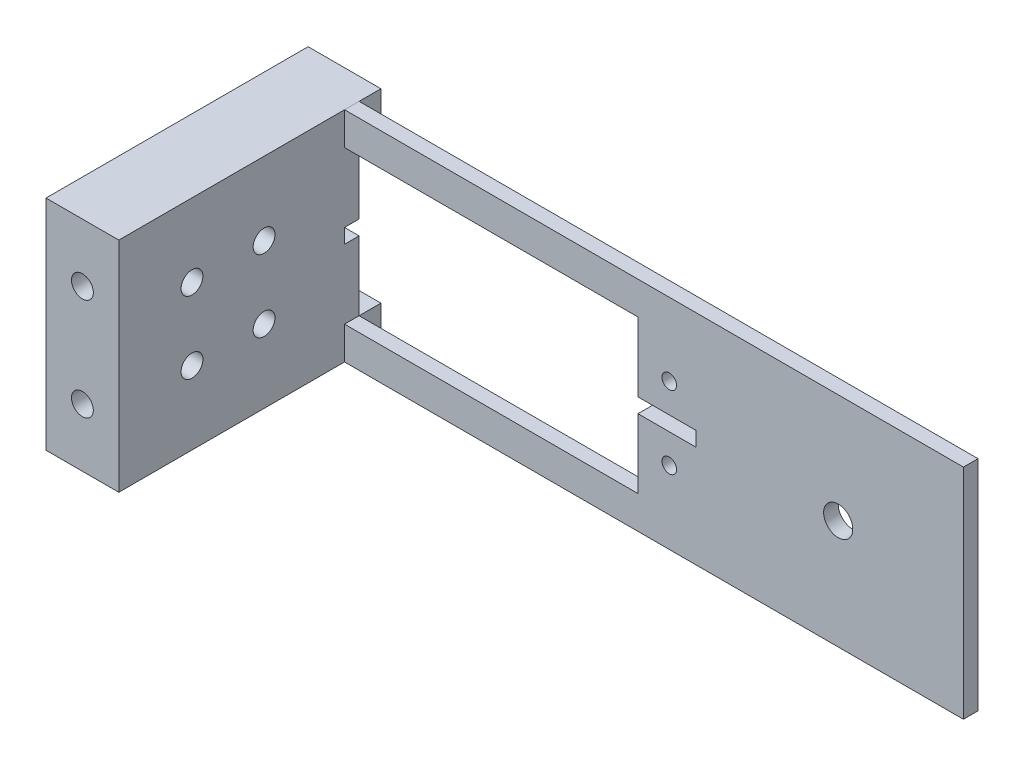
ISO-10303-21;
HEADER;
FILE_DESCRIPTION(('STEP AP214'),'2;1');
FILE_NAME('part.step','',(''),(''),'','','');
FILE_SCHEMA(('AUTOMOTIVE_DESIGN { 1 0 10303 214 1 1 1 1 }'));
ENDSEC;
DATA;
#1=APPLICATION_CONTEXT('core data for automotive mechanical design processes');
#2=APPLICATION_PROTOCOL_DEFINITION('international standard','automotive_design',2000,#1);
#3=PRODUCT_CONTEXT('',#1,'mechanical');
#4=PRODUCT('Part','Part','',(#3));
#5=PRODUCT_RELATED_PRODUCT_CATEGORY('part','',(#4));
#6=PRODUCT_DEFINITION_FORMATION('','',#4);
#7=PRODUCT_DEFINITION_CONTEXT('part definition',#1,'design');
#8=PRODUCT_DEFINITION('design','',#6,#7);
#9=PRODUCT_DEFINITION_SHAPE('','',#8);
#10=(LENGTH_UNIT() NAMED_UNIT(*) SI_UNIT(.MILLI.,.METRE.));
#11=(NAMED_UNIT(*) PLANE_ANGLE_UNIT() SI_UNIT($,.RADIAN.));
#12=(NAMED_UNIT(*) SI_UNIT($,.STERADIAN.) SOLID_ANGLE_UNIT());
#13=UNCERTAINTY_MEASURE_WITH_UNIT(LENGTH_MEASURE(1.E-05),#10,'distance_accuracy_value','');
#14=(GEOMETRIC_REPRESENTATION_CONTEXT(3) GLOBAL_UNCERTAINTY_ASSIGNED_CONTEXT((#13)) GLOBAL_UNIT_ASSIGNED_CONTEXT((#10,
#11,#12)) REPRESENTATION_CONTEXT('',''));
#15=CARTESIAN_POINT('',(0.,0.,0.));
#16=DIRECTION('',(0.,0.,1.));
#17=DIRECTION('',(1.,0.,0.));
#18=AXIS2_PLACEMENT_3D('',#15,#16,#17);
#19=CARTESIAN_POINT('',(10.,14.,-33.));
#20=DIRECTION('',(1.,0.,0.));
#21=DIRECTION('',(0.,0.,-1.));
#22=AXIS2_PLACEMENT_3D('',#19,#20,#21);
#23=PLANE('',#22);
#24=DIRECTION('',(0.,-1.,0.));
#25=VECTOR('',#24,1.);
#26=CARTESIAN_POINT('',(10.,4.5,-33.));
#27=LINE('',#26,#25);
#28=CARTESIAN_POINT('',(9.99999999999999,25.5,-33.));
#29=VERTEX_POINT('',#28);
#30=CARTESIAN_POINT('',(10.,16.,-33.));
#31=VERTEX_POINT('',#30);
#32=EDGE_CURVE('E143',#29,#31,#27,.T.);
#33=ORIENTED_EDGE('',*,*,#32,.F.);
#34=DIRECTION('',(0.,0.,-1.));
#35=VECTOR('',#34,1.);
#36=CARTESIAN_POINT('',(10.,25.5,-33.));
#37=LINE('',#36,#35);
#38=CARTESIAN_POINT('',(10.,25.5,-36.));
#39=VERTEX_POINT('',#38);
#40=EDGE_CURVE('E147',#29,#39,#37,.T.);
#41=ORIENTED_EDGE('',*,*,#40,.T.);
#42=DIRECTION('',(0.,-1.,0.));
#43=VECTOR('',#42,1.);
#44=CARTESIAN_POINT('',(10.,30.,-36.));
#45=LINE('',#44,#43);
#46=CARTESIAN_POINT('',(10.,30.,-36.));
#47=VERTEX_POINT('',#46);
#48=EDGE_CURVE('E229',#47,#39,#45,.T.);
#49=ORIENTED_EDGE('',*,*,#48,.F.);
#50=DIRECTION('',(0.,0.,-1.));
#51=VECTOR('',#50,1.);
#52=CARTESIAN_POINT('',(9.99999999999994,30.,0.));
#53=LINE('',#52,#51);
#54=CARTESIAN_POINT('',(10.,30.,0.));
#55=VERTEX_POINT('',#54);
#56=EDGE_CURVE('E261',#55,#47,#53,.T.);
#57=ORIENTED_EDGE('',*,*,#56,.F.);
#58=DIRECTION('',(0.,-1.,0.));
#59=VECTOR('',#58,1.);
#60=CARTESIAN_POINT('',(10.,30.,0.));
#61=LINE('',#60,#59);
#62=CARTESIAN_POINT('',(10.,0.,0.));
#63=VERTEX_POINT('',#62);
#64=EDGE_CURVE('E253',#55,#63,#61,.T.);
#65=ORIENTED_EDGE('',*,*,#64,.T.);
#66=DIRECTION('',(0.,0.,-1.));
#67=VECTOR('',#66,1.);
#68=CARTESIAN_POINT('',(9.99999999999994,0.,0.));
#69=LINE('',#68,#67);
#70=CARTESIAN_POINT('',(10.,0.,-36.));
#71=VERTEX_POINT('',#70);
#72=EDGE_CURVE('E246',#63,#71,#69,.T.);
#73=ORIENTED_EDGE('',*,*,#72,.T.);
#74=CARTESIAN_POINT('',(10.,4.5,-36.));
#75=VERTEX_POINT('',#74);
#76=EDGE_CURVE('E248',#75,#71,#45,.T.);
#77=ORIENTED_EDGE('',*,*,#76,.F.);
#78=DIRECTION('',(0.,0.,-1.));
#79=VECTOR('',#78,1.);
#80=CARTESIAN_POINT('',(10.,4.5,-33.));
#81=LINE('',#80,#79);
#82=CARTESIAN_POINT('',(10.,4.5,-33.));
#83=VERTEX_POINT('',#82);
#84=EDGE_CURVE('E171',#83,#75,#81,.T.);
#85=ORIENTED_EDGE('',*,*,#84,.F.);
#86=CARTESIAN_POINT('',(10.,14.,-33.));
#87=VERTEX_POINT('',#86);
#88=EDGE_CURVE('E154',#87,#83,#27,.T.);
#89=ORIENTED_EDGE('',*,*,#88,.F.);
#90=DIRECTION('',(0.,0.,1.));
#91=VECTOR('',#90,1.);
#92=CARTESIAN_POINT('',(10.,14.,0.));
#93=LINE('',#92,#91);
#94=CARTESIAN_POINT('',(10.,14.,-31.));
#95=VERTEX_POINT('',#94);
#96=EDGE_CURVE('E185',#87,#95,#93,.T.);
#97=ORIENTED_EDGE('',*,*,#96,.T.);
#98=DIRECTION('',(0.,-1.,0.));
#99=VECTOR('',#98,1.);
#100=CARTESIAN_POINT('',(10.,30.,-31.));
#101=LINE('',#100,#99);
#102=CARTESIAN_POINT('',(10.,16.,-31.));
#103=VERTEX_POINT('',#102);
#104=EDGE_CURVE('E183',#103,#95,#101,.T.);
#105=ORIENTED_EDGE('',*,*,#104,.F.);
#106=DIRECTION('',(0.,0.,-1.));
#107=VECTOR('',#106,1.);
#108=CARTESIAN_POINT('',(10.,16.,0.));
#109=LINE('',#108,#107);
#110=EDGE_CURVE('E150',#103,#31,#109,.T.);
#111=ORIENTED_EDGE('',*,*,#110,.T.);
#112=EDGE_LOOP('',(#33,#41,#49,#57,#65,#73,#77,#85,#89,#97,#105,#111));
#113=FACE_BOUND('',#112,.T.);
#114=CARTESIAN_POINT('',(10.,19.9497474683058,-10.0502525316942));
#115=DIRECTION('',(-1.,0.,0.));
#116=DIRECTION('',(0.,0.,1.));
#117=AXIS2_PLACEMENT_3D('',#114,#115,#116);
#118=CIRCLE('',#117,1.5);
#119=CARTESIAN_POINT('',(10.,19.9497474683058,-8.55025253169417));
#120=VERTEX_POINT('',#119);
#121=EDGE_CURVE('E232',#120,#120,#118,.T.);
#122=ORIENTED_EDGE('',*,*,#121,.T.);
#123=EDGE_LOOP('',(#122));
#124=FACE_BOUND('',#123,.T.);
#125=CARTESIAN_POINT('',(10.,10.0502525316942,-19.9497474683058));
#126=DIRECTION('',(-1.,0.,0.));
#127=DIRECTION('',(0.,0.,1.));
#128=AXIS2_PLACEMENT_3D('',#125,#126,#127);
#129=CIRCLE('',#128,1.5);
#130=CARTESIAN_POINT('',(10.,10.0502525316942,-18.4497474683058));
#131=VERTEX_POINT('',#130);
#132=EDGE_CURVE('E235',#131,#131,#129,.T.);
#133=ORIENTED_EDGE('',*,*,#132,.T.);
#134=EDGE_LOOP('',(#133));
#135=FACE_BOUND('',#134,.T.);
#136=CARTESIAN_POINT('',(10.,10.0502525316942,-10.0502525316942));
#137=DIRECTION('',(-1.,0.,0.));
#138=DIRECTION('',(0.,0.,1.));
#139=AXIS2_PLACEMENT_3D('',#136,#137,#138);
#140=CIRCLE('',#139,1.5);
#141=CARTESIAN_POINT('',(10.,10.0502525316942,-8.55025253169416));
#142=VERTEX_POINT('',#141);
#143=EDGE_CURVE('E239',#142,#142,#140,.T.);
#144=ORIENTED_EDGE('',*,*,#143,.T.);
#145=EDGE_LOOP('',(#144));
#146=FACE_BOUND('',#145,.T.);
#147=CARTESIAN_POINT('',(10.,19.9497474683058,-19.9497474683058));
#148=DIRECTION('',(-1.,0.,0.));
#149=DIRECTION('',(0.,0.,1.));
#150=AXIS2_PLACEMENT_3D('',#147,#148,#149);
#151=CIRCLE('',#150,1.5);
#152=CARTESIAN_POINT('',(10.,19.9497474683058,-18.4497474683058));
#153=VERTEX_POINT('',#152);
#154=EDGE_CURVE('E243',#153,#153,#151,.T.);
#155=ORIENTED_EDGE('',*,*,#154,.T.);
#156=EDGE_LOOP('',(#155));
#157=FACE_BOUND('',#156,.T.);
#158=ADVANCED_FACE('F49',(#113,#124,#135,#146,#157),#23,.T.);
#159=CARTESIAN_POINT('',(5.4,9.99999999999999,-29.));
#160=DIRECTION('',(0.,0.,-1.));
#161=DIRECTION('',(-1.,0.,0.));
#162=AXIS2_PLACEMENT_3D('',#159,#160,#161);
#163=PLANE('',#162);
#164=CARTESIAN_POINT('',(5.4,9.99999999999999,-29.));
#165=DIRECTION('',(0.,0.,-1.));
#166=DIRECTION('',(-1.,0.,0.));
#167=AXIS2_PLACEMENT_3D('',#164,#165,#166);
#168=CIRCLE('',#167,1.);
#169=CARTESIAN_POINT('',(4.4,9.99999999999999,-29.));
#170=VERTEX_POINT('',#169);
#171=EDGE_CURVE('E195',#170,#170,#168,.T.);
#172=ORIENTED_EDGE('',*,*,#171,.T.);
#173=EDGE_LOOP('',(#172));
#174=FACE_BOUND('',#173,.T.);
#175=ADVANCED_FACE('F329',(#174),#163,.T.);
#176=CARTESIAN_POINT('',(5.,22.,-4.));
#177=DIRECTION('',(0.,0.,1.));
#178=DIRECTION('',(1.,0.,0.));
#179=AXIS2_PLACEMENT_3D('',#176,#177,#178);
#180=PLANE('',#179);
#181=CARTESIAN_POINT('',(5.,22.,-4.));
#182=DIRECTION('',(0.,0.,1.));
#183=DIRECTION('',(1.,0.,0.));
#184=AXIS2_PLACEMENT_3D('',#181,#182,#183);
#185=CIRCLE('',#184,1.5);
#186=CARTESIAN_POINT('',(6.5,22.,-4.));
#187=VERTEX_POINT('',#186);
#188=EDGE_CURVE('E205',#187,#187,#185,.T.);
#189=ORIENTED_EDGE('',*,*,#188,.T.);
#190=EDGE_LOOP('',(#189));
#191=FACE_BOUND('',#190,.T.);
#192=ADVANCED_FACE('F331',(#191),#180,.T.);
#193=CARTESIAN_POINT('',(5.,8.,-4.));
#194=DIRECTION('',(0.,0.,1.));
#195=DIRECTION('',(1.,0.,0.));
#196=AXIS2_PLACEMENT_3D('',#193,#194,#195);
#197=PLANE('',#196);
#198=CARTESIAN_POINT('',(5.,8.,-4.));
#199=DIRECTION('',(0.,0.,1.));
#200=DIRECTION('',(1.,0.,0.));
#201=AXIS2_PLACEMENT_3D('',#198,#199,#200);
#202=CIRCLE('',#201,1.5);
#203=CARTESIAN_POINT('',(6.5,8.,-4.));
#204=VERTEX_POINT('',#203);
#205=EDGE_CURVE('E58',#204,#204,#202,.T.);
#206=ORIENTED_EDGE('',*,*,#205,.T.);
#207=EDGE_LOOP('',(#206));
#208=FACE_BOUND('',#207,.T.);
#209=ADVANCED_FACE('F338',(#208),#197,.T.);
#210=CARTESIAN_POINT('',(5.4,20.,-29.));
#211=DIRECTION('',(0.,0.,-1.));
#212=DIRECTION('',(-1.,0.,0.));
#213=AXIS2_PLACEMENT_3D('',#210,#211,#212);
#214=PLANE('',#213);
#215=CARTESIAN_POINT('',(5.4,20.,-29.));
#216=DIRECTION('',(0.,0.,-1.));
#217=DIRECTION('',(-1.,0.,0.));
#218=AXIS2_PLACEMENT_3D('',#215,#216,#217);
#219=CIRCLE('',#218,1.);
#220=CARTESIAN_POINT('',(4.4,20.,-29.));
#221=VERTEX_POINT('',#220);
#222=EDGE_CURVE('E199',#221,#221,#219,.T.);
#223=ORIENTED_EDGE('',*,*,#222,.T.);
#224=EDGE_LOOP('',(#223));
#225=FACE_BOUND('',#224,.T.);
#226=ADVANCED_FACE('F350',(#225),#214,.T.);
#227=CARTESIAN_POINT('',(5.4,9.99999999999999,-29.));
#228=DIRECTION('',(0.,0.,-1.));
#229=DIRECTION('',(-1.,0.,0.));
#230=AXIS2_PLACEMENT_3D('',#227,#228,#229);
#231=CYLINDRICAL_SURFACE('',#230,1.);
#232=ORIENTED_EDGE('',*,*,#171,.F.);
#233=EDGE_LOOP('',(#232));
#234=FACE_BOUND('',#233,.T.);
#235=CARTESIAN_POINT('',(5.4,9.99999999999999,-33.));
#236=DIRECTION('',(0.,0.,-1.));
#237=DIRECTION('',(-1.,0.,0.));
#238=AXIS2_PLACEMENT_3D('',#235,#236,#237);
#239=CIRCLE('',#238,1.);
#240=CARTESIAN_POINT('',(4.4,9.99999999999999,-33.));
#241=VERTEX_POINT('',#240);
#242=EDGE_CURVE('E196',#241,#241,#239,.T.);
#243=ORIENTED_EDGE('',*,*,#242,.T.);
#244=EDGE_LOOP('',(#243));
#245=FACE_BOUND('',#244,.T.);
#246=ADVANCED_FACE('F344',(#234,#245),#231,.F.);
#247=CARTESIAN_POINT('',(5.,22.,-4.));
#248=DIRECTION('',(0.,0.,1.));
#249=DIRECTION('',(1.,0.,0.));
#250=AXIS2_PLACEMENT_3D('',#247,#248,#249);
#251=CYLINDRICAL_SURFACE('',#250,1.5);
#252=ORIENTED_EDGE('',*,*,#188,.F.);
#253=EDGE_LOOP('',(#252));
#254=FACE_BOUND('',#253,.T.);
#255=CARTESIAN_POINT('',(5.,22.,0.));
#256=DIRECTION('',(0.,0.,1.));
#257=DIRECTION('',(1.,0.,0.));
#258=AXIS2_PLACEMENT_3D('',#255,#256,#257);
#259=CIRCLE('',#258,1.5);
#260=CARTESIAN_POINT('',(6.5,22.,0.));
#261=VERTEX_POINT('',#260);
#262=EDGE_CURVE('E208',#261,#261,#259,.T.);
#263=ORIENTED_EDGE('',*,*,#262,.T.);
#264=EDGE_LOOP('',(#263));
#265=FACE_BOUND('',#264,.T.);
#266=ADVANCED_FACE('F354',(#254,#265),#251,.F.);
#267=CARTESIAN_POINT('',(5.,8.,-4.));
#268=DIRECTION('',(0.,0.,1.));
#269=DIRECTION('',(1.,0.,0.));
#270=AXIS2_PLACEMENT_3D('',#267,#268,#269);
#271=CYLINDRICAL_SURFACE('',#270,1.5);
#272=ORIENTED_EDGE('',*,*,#205,.F.);
#273=EDGE_LOOP('',(#272));
#274=FACE_BOUND('',#273,.T.);
#275=CARTESIAN_POINT('',(5.,8.,0.));
#276=DIRECTION('',(0.,0.,1.));
#277=DIRECTION('',(1.,0.,0.));
#278=AXIS2_PLACEMENT_3D('',#275,#276,#277);
#279=CIRCLE('',#278,1.5);
#280=CARTESIAN_POINT('',(6.5,8.,0.));
#281=VERTEX_POINT('',#280);
#282=EDGE_CURVE('E13',#281,#281,#279,.T.);
#283=ORIENTED_EDGE('',*,*,#282,.T.);
#284=EDGE_LOOP('',(#283));
#285=FACE_BOUND('',#284,.T.);
#286=ADVANCED_FACE('F356',(#274,#285),#271,.F.);
#287=CARTESIAN_POINT('',(10.,25.5,-33.));
#288=DIRECTION('',(0.,1.,0.));
#289=DIRECTION('',(0.,0.,1.));
#290=AXIS2_PLACEMENT_3D('',#287,#288,#289);
#291=PLANE('',#290);
#292=DIRECTION('',(1.,0.,0.));
#293=VECTOR('',#292,1.);
#294=CARTESIAN_POINT('',(10.,25.5,-36.));
#295=LINE('',#294,#293);
#296=CARTESIAN_POINT('',(2.,25.5,-36.));
#297=VERTEX_POINT('',#296);
#298=EDGE_CURVE('E163',#297,#39,#295,.T.);
#299=ORIENTED_EDGE('',*,*,#298,.T.);
#300=ORIENTED_EDGE('',*,*,#40,.F.);
#301=DIRECTION('',(1.,0.,0.));
#302=VECTOR('',#301,1.);
#303=CARTESIAN_POINT('',(10.,25.5,-33.));
#304=LINE('',#303,#302);
#305=CARTESIAN_POINT('',(2.,25.5,-33.));
#306=VERTEX_POINT('',#305);
#307=EDGE_CURVE('E161',#306,#29,#304,.T.);
#308=ORIENTED_EDGE('',*,*,#307,.F.);
#309=DIRECTION('',(0.,0.,-1.));
#310=VECTOR('',#309,1.);
#311=CARTESIAN_POINT('',(2.,25.5,-33.));
#312=LINE('',#311,#310);
#313=EDGE_CURVE('E164',#306,#297,#312,.T.);
#314=ORIENTED_EDGE('',*,*,#313,.T.);
#315=EDGE_LOOP('',(#299,#300,#308,#314));
#316=FACE_BOUND('',#315,.T.);
#317=ADVANCED_FACE('F159',(#316),#291,.F.);
#318=CARTESIAN_POINT('',(5.4,20.,-29.));
#319=DIRECTION('',(0.,0.,-1.));
#320=DIRECTION('',(-1.,0.,0.));
#321=AXIS2_PLACEMENT_3D('',#318,#319,#320);
#322=CYLINDRICAL_SURFACE('',#321,1.);
#323=ORIENTED_EDGE('',*,*,#222,.F.);
#324=EDGE_LOOP('',(#323));
#325=FACE_BOUND('',#324,.T.);
#326=CARTESIAN_POINT('',(5.4,20.,-33.));
#327=DIRECTION('',(0.,0.,-1.));
#328=DIRECTION('',(-1.,0.,0.));
#329=AXIS2_PLACEMENT_3D('',#326,#327,#328);
#330=CIRCLE('',#329,1.);
#331=CARTESIAN_POINT('',(4.4,20.,-33.));
#332=VERTEX_POINT('',#331);
#333=EDGE_CURVE('E202',#332,#332,#330,.T.);
#334=ORIENTED_EDGE('',*,*,#333,.T.);
#335=EDGE_LOOP('',(#334));
#336=FACE_BOUND('',#335,.T.);
#337=ADVANCED_FACE('F346',(#325,#336),#322,.F.);
#338=CARTESIAN_POINT('',(0.,0.,-33.));
#339=DIRECTION('',(0.,0.,1.));
#340=DIRECTION('',(1.,0.,0.));
#341=AXIS2_PLACEMENT_3D('',#338,#339,#340);
#342=PLANE('',#341);
#343=ORIENTED_EDGE('',*,*,#242,.F.);
#344=EDGE_LOOP('',(#343));
#345=FACE_BOUND('',#344,.T.);
#346=DIRECTION('',(0.,1.,0.));
#347=VECTOR('',#346,1.);
#348=CARTESIAN_POINT('',(2.,4.5,-33.));
#349=LINE('',#348,#347);
#350=CARTESIAN_POINT('',(2.,4.5,-33.));
#351=VERTEX_POINT('',#350);
#352=CARTESIAN_POINT('',(2.,14.,-33.));
#353=VERTEX_POINT('',#352);
#354=EDGE_CURVE('E170',#351,#353,#349,.T.);
#355=ORIENTED_EDGE('',*,*,#354,.T.);
#356=DIRECTION('',(1.,0.,0.));
#357=VECTOR('',#356,1.);
#358=CARTESIAN_POINT('',(0.,14.,-33.));
#359=LINE('',#358,#357);
#360=EDGE_CURVE('E222',#353,#87,#359,.T.);
#361=ORIENTED_EDGE('',*,*,#360,.T.);
#362=ORIENTED_EDGE('',*,*,#88,.T.);
#363=DIRECTION('',(-1.,0.,0.));
#364=VECTOR('',#363,1.);
#365=CARTESIAN_POINT('',(10.,4.5,-33.));
#366=LINE('',#365,#364);
#367=EDGE_CURVE('E155',#83,#351,#366,.T.);
#368=ORIENTED_EDGE('',*,*,#367,.T.);
#369=EDGE_LOOP('',(#355,#361,#362,#368));
#370=FACE_BOUND('',#369,.T.);
#371=ADVANCED_FACE('F224',(#345,#370),#342,.F.);
#372=ORIENTED_EDGE('',*,*,#333,.F.);
#373=EDGE_LOOP('',(#372));
#374=FACE_BOUND('',#373,.T.);
#375=ORIENTED_EDGE('',*,*,#32,.T.);
#376=DIRECTION('',(-1.,0.,0.));
#377=VECTOR('',#376,1.);
#378=CARTESIAN_POINT('',(0.,16.,-33.));
#379=LINE('',#378,#377);
#380=CARTESIAN_POINT('',(2.,16.,-33.));
#381=VERTEX_POINT('',#380);
#382=EDGE_CURVE('E227',#31,#381,#379,.T.);
#383=ORIENTED_EDGE('',*,*,#382,.T.);
#384=EDGE_CURVE('E168',#381,#306,#349,.T.);
#385=ORIENTED_EDGE('',*,*,#384,.T.);
#386=ORIENTED_EDGE('',*,*,#307,.T.);
#387=EDGE_LOOP('',(#375,#383,#385,#386));
#388=FACE_BOUND('',#387,.T.);
#389=ADVANCED_FACE('F167',(#374,#388),#342,.F.);
#390=CARTESIAN_POINT('',(58.3,16.,-31.));
#391=DIRECTION('',(0.,1.,0.));
#392=DIRECTION('',(-1.,0.,0.));
#393=AXIS2_PLACEMENT_3D('',#390,#391,#392);
#394=PLANE('',#393);
#395=DIRECTION('',(1.,0.,0.));
#396=VECTOR('',#395,1.);
#397=CARTESIAN_POINT('',(58.3,16.,-31.));
#398=LINE('',#397,#396);
#399=CARTESIAN_POINT('',(2.,16.,-31.));
#400=VERTEX_POINT('',#399);
#401=EDGE_CURVE('E53',#400,#103,#398,.T.);
#402=ORIENTED_EDGE('',*,*,#401,.F.);
#403=DIRECTION('',(0.,0.,-1.));
#404=VECTOR('',#403,1.);
#405=CARTESIAN_POINT('',(2.,16.,-31.));
#406=LINE('',#405,#404);
#407=EDGE_CURVE('E66',#400,#381,#406,.T.);
#408=ORIENTED_EDGE('',*,*,#407,.T.);
#409=ORIENTED_EDGE('',*,*,#382,.F.);
#410=ORIENTED_EDGE('',*,*,#110,.F.);
#411=EDGE_LOOP('',(#402,#408,#409,#410));
#412=FACE_BOUND('',#411,.T.);
#413=ADVANCED_FACE('F51',(#412),#394,.F.);
#414=CARTESIAN_POINT('',(2.,4.5,-33.));
#415=DIRECTION('',(-1.,0.,0.));
#416=DIRECTION('',(0.,0.,1.));
#417=AXIS2_PLACEMENT_3D('',#414,#415,#416);
#418=PLANE('',#417);
#419=ORIENTED_EDGE('',*,*,#384,.F.);
#420=ORIENTED_EDGE('',*,*,#407,.F.);
#421=DIRECTION('',(0.,1.,0.));
#422=VECTOR('',#421,1.);
#423=CARTESIAN_POINT('',(2.,16.,-31.));
#424=LINE('',#423,#422);
#425=CARTESIAN_POINT('',(2.,14.,-31.));
#426=VERTEX_POINT('',#425);
#427=EDGE_CURVE('E193',#426,#400,#424,.T.);
#428=ORIENTED_EDGE('',*,*,#427,.F.);
#429=DIRECTION('',(0.,0.,-1.));
#430=VECTOR('',#429,1.);
#431=CARTESIAN_POINT('',(2.,14.,-31.));
#432=LINE('',#431,#430);
#433=EDGE_CURVE('E189',#426,#353,#432,.T.);
#434=ORIENTED_EDGE('',*,*,#433,.T.);
#435=ORIENTED_EDGE('',*,*,#354,.F.);
#436=DIRECTION('',(0.,0.,-1.));
#437=VECTOR('',#436,1.);
#438=CARTESIAN_POINT('',(2.,4.5,-33.));
#439=LINE('',#438,#437);
#440=CARTESIAN_POINT('',(2.,4.5,-36.));
#441=VERTEX_POINT('',#440);
#442=EDGE_CURVE('E175',#351,#441,#439,.T.);
#443=ORIENTED_EDGE('',*,*,#442,.T.);
#444=DIRECTION('',(0.,1.,0.));
#445=VECTOR('',#444,1.);
#446=CARTESIAN_POINT('',(2.,4.5,-36.));
#447=LINE('',#446,#445);
#448=EDGE_CURVE('E289',#441,#297,#447,.T.);
#449=ORIENTED_EDGE('',*,*,#448,.T.);
#450=ORIENTED_EDGE('',*,*,#313,.F.);
#451=EDGE_LOOP('',(#419,#420,#428,#434,#435,#443,#449,#450));
#452=FACE_BOUND('',#451,.T.);
#453=ADVANCED_FACE('F369',(#452),#418,.F.);
#454=CARTESIAN_POINT('',(58.3,14.,-31.));
#455=DIRECTION('',(0.,-1.,0.));
#456=DIRECTION('',(1.,0.,0.));
#457=AXIS2_PLACEMENT_3D('',#454,#455,#456);
#458=PLANE('',#457);
#459=ORIENTED_EDGE('',*,*,#360,.F.);
#460=ORIENTED_EDGE('',*,*,#433,.F.);
#461=DIRECTION('',(-1.,0.,0.));
#462=VECTOR('',#461,1.);
#463=CARTESIAN_POINT('',(58.3,14.,-31.));
#464=LINE('',#463,#462);
#465=EDGE_CURVE('E74',#95,#426,#464,.T.);
#466=ORIENTED_EDGE('',*,*,#465,.F.);
#467=ORIENTED_EDGE('',*,*,#96,.F.);
#468=EDGE_LOOP('',(#459,#460,#466,#467));
#469=FACE_BOUND('',#468,.T.);
#470=ADVANCED_FACE('F221',(#469),#458,.F.);
#471=CARTESIAN_POINT('',(0.,0.,-31.));
#472=DIRECTION('',(0.,0.,-1.));
#473=DIRECTION('',(-1.,0.,0.));
#474=AXIS2_PLACEMENT_3D('',#471,#472,#473);
#475=PLANE('',#474);
#476=ORIENTED_EDGE('',*,*,#104,.T.);
#477=ORIENTED_EDGE('',*,*,#465,.T.);
#478=ORIENTED_EDGE('',*,*,#427,.T.);
#479=ORIENTED_EDGE('',*,*,#401,.T.);
#480=EDGE_LOOP('',(#476,#477,#478,#479));
#481=FACE_BOUND('',#480,.T.);
#482=ADVANCED_FACE('F215',(#481),#475,.T.);
#483=CARTESIAN_POINT('',(0.,30.,-36.));
#484=DIRECTION('',(0.,0.,-1.));
#485=DIRECTION('',(-1.,0.,0.));
#486=AXIS2_PLACEMENT_3D('',#483,#484,#485);
#487=PLANE('',#486);
#488=ORIENTED_EDGE('',*,*,#298,.F.);
#489=ORIENTED_EDGE('',*,*,#448,.F.);
#490=DIRECTION('',(-1.,0.,0.));
#491=VECTOR('',#490,1.);
#492=CARTESIAN_POINT('',(10.,4.5,-36.));
#493=LINE('',#492,#491);
#494=EDGE_CURVE('E178',#75,#441,#493,.T.);
#495=ORIENTED_EDGE('',*,*,#494,.F.);
#496=ORIENTED_EDGE('',*,*,#76,.T.);
#497=DIRECTION('',(1.,0.,0.));
#498=VECTOR('',#497,1.);
#499=CARTESIAN_POINT('',(0.,0.,-36.));
#500=LINE('',#499,#498);
#501=CARTESIAN_POINT('',(0.,0.,-36.));
#502=VERTEX_POINT('',#501);
#503=EDGE_CURVE('E264',#502,#71,#500,.T.);
#504=ORIENTED_EDGE('',*,*,#503,.F.);
#505=DIRECTION('',(0.,-1.,0.));
#506=VECTOR('',#505,1.);
#507=CARTESIAN_POINT('',(0.,30.,-36.));
#508=LINE('',#507,#506);
#509=CARTESIAN_POINT('',(0.,30.,-36.));
#510=VERTEX_POINT('',#509);
#511=EDGE_CURVE('E249',#510,#502,#508,.T.);
#512=ORIENTED_EDGE('',*,*,#511,.F.);
#513=DIRECTION('',(1.,0.,0.));
#514=VECTOR('',#513,1.);
#515=CARTESIAN_POINT('',(0.,30.,-36.));
#516=LINE('',#515,#514);
#517=EDGE_CURVE('E274',#510,#47,#516,.T.);
#518=ORIENTED_EDGE('',*,*,#517,.T.);
#519=ORIENTED_EDGE('',*,*,#48,.T.);
#520=EDGE_LOOP('',(#488,#489,#495,#496,#504,#512,#518,#519));
#521=FACE_BOUND('',#520,.T.);
#522=ADVANCED_FACE('F297',(#521),#487,.T.);
#523=CARTESIAN_POINT('',(10.,4.5,-33.));
#524=DIRECTION('',(0.,-1.,0.));
#525=DIRECTION('',(0.,0.,-1.));
#526=AXIS2_PLACEMENT_3D('',#523,#524,#525);
#527=PLANE('',#526);
#528=ORIENTED_EDGE('',*,*,#494,.T.);
#529=ORIENTED_EDGE('',*,*,#442,.F.);
#530=ORIENTED_EDGE('',*,*,#367,.F.);
#531=ORIENTED_EDGE('',*,*,#84,.T.);
#532=EDGE_LOOP('',(#528,#529,#530,#531));
#533=FACE_BOUND('',#532,.T.);
#534=ADVANCED_FACE('F294',(#533),#527,.F.);
#535=CARTESIAN_POINT('',(0.,30.,0.));
#536=DIRECTION('',(-1.,0.,0.));
#537=DIRECTION('',(0.,0.,1.));
#538=AXIS2_PLACEMENT_3D('',#535,#536,#537);
#539=PLANE('',#538);
#540=CARTESIAN_POINT('',(0.,19.9497474683058,-10.0502525316942));
#541=DIRECTION('',(-1.,0.,0.));
#542=DIRECTION('',(0.,0.,1.));
#543=AXIS2_PLACEMENT_3D('',#540,#541,#542);
#544=CIRCLE('',#543,1.5);
#545=CARTESIAN_POINT('',(0.,19.9497474683058,-8.55025253169417));
#546=VERTEX_POINT('',#545);
#547=EDGE_CURVE('E242',#546,#546,#544,.T.);
#548=ORIENTED_EDGE('',*,*,#547,.F.);
#549=EDGE_LOOP('',(#548));
#550=FACE_BOUND('',#549,.T.);
#551=CARTESIAN_POINT('',(0.,10.0502525316942,-19.9497474683058));
#552=DIRECTION('',(-1.,0.,0.));
#553=DIRECTION('',(0.,0.,1.));
#554=AXIS2_PLACEMENT_3D('',#551,#552,#553);
#555=CIRCLE('',#554,1.5);
#556=CARTESIAN_POINT('',(0.,10.0502525316942,-18.4497474683058));
#557=VERTEX_POINT('',#556);
#558=EDGE_CURVE('E282',#557,#557,#555,.T.);
#559=ORIENTED_EDGE('',*,*,#558,.F.);
#560=EDGE_LOOP('',(#559));
#561=FACE_BOUND('',#560,.T.);
#562=CARTESIAN_POINT('',(0.,10.0502525316942,-10.0502525316942));
#563=DIRECTION('',(-1.,0.,0.));
#564=DIRECTION('',(0.,0.,1.));
#565=AXIS2_PLACEMENT_3D('',#562,#563,#564);
#566=CIRCLE('',#565,1.5);
#567=CARTESIAN_POINT('',(0.,10.0502525316942,-8.55025253169416));
#568=VERTEX_POINT('',#567);
#569=EDGE_CURVE('E165',#568,#568,#566,.T.);
#570=ORIENTED_EDGE('',*,*,#569,.F.);
#571=EDGE_LOOP('',(#570));
#572=FACE_BOUND('',#571,.T.);
#573=CARTESIAN_POINT('',(0.,19.9497474683058,-19.9497474683058));
#574=DIRECTION('',(-1.,0.,0.));
#575=DIRECTION('',(0.,0.,1.));
#576=AXIS2_PLACEMENT_3D('',#573,#574,#575);
#577=CIRCLE('',#576,1.5);
#578=CARTESIAN_POINT('',(0.,19.9497474683058,-18.4497474683058));
#579=VERTEX_POINT('',#578);
#580=EDGE_CURVE('E236',#579,#579,#577,.T.);
#581=ORIENTED_EDGE('',*,*,#580,.F.);
#582=EDGE_LOOP('',(#581));
#583=FACE_BOUND('',#582,.T.);
#584=DIRECTION('',(0.,0.,-1.));
#585=VECTOR('',#584,1.);
#586=CARTESIAN_POINT('',(0.,0.,0.));
#587=LINE('',#586,#585);
#588=CARTESIAN_POINT('',(0.,0.,0.));
#589=VERTEX_POINT('',#588);
#590=EDGE_CURVE('E260',#589,#502,#587,.T.);
#591=ORIENTED_EDGE('',*,*,#590,.F.);
#592=DIRECTION('',(0.,-1.,0.));
#593=VECTOR('',#592,1.);
#594=CARTESIAN_POINT('',(0.,30.,0.));
#595=LINE('',#594,#593);
#596=CARTESIAN_POINT('',(0.,30.,0.));
#597=VERTEX_POINT('',#596);
#598=EDGE_CURVE('E251',#597,#589,#595,.T.);
#599=ORIENTED_EDGE('',*,*,#598,.F.);
#600=DIRECTION('',(0.,0.,-1.));
#601=VECTOR('',#600,1.);
#602=CARTESIAN_POINT('',(0.,30.,0.));
#603=LINE('',#602,#601);
#604=EDGE_CURVE('E271',#597,#510,#603,.T.);
#605=ORIENTED_EDGE('',*,*,#604,.T.);
#606=ORIENTED_EDGE('',*,*,#511,.T.);
#607=EDGE_LOOP('',(#591,#599,#605,#606));
#608=FACE_BOUND('',#607,.T.);
#609=ADVANCED_FACE('F311',(#550,#561,#572,#583,#608),#539,.T.);
#610=CARTESIAN_POINT('',(95.,19.9497474683058,-10.0502525316942));
#611=DIRECTION('',(-1.,0.,0.));
#612=DIRECTION('',(0.,0.,1.));
#613=AXIS2_PLACEMENT_3D('',#610,#611,#612);
#614=CYLINDRICAL_SURFACE('',#613,1.5);
#615=ORIENTED_EDGE('',*,*,#547,.T.);
#616=EDGE_LOOP('',(#615));
#617=FACE_BOUND('',#616,.T.);
#618=ORIENTED_EDGE('',*,*,#121,.F.);
#619=EDGE_LOOP('',(#618));
#620=FACE_BOUND('',#619,.T.);
#621=ADVANCED_FACE('F314',(#617,#620),#614,.F.);
#622=CARTESIAN_POINT('',(95.,10.0502525316942,-19.9497474683058));
#623=DIRECTION('',(-1.,0.,0.));
#624=DIRECTION('',(0.,0.,1.));
#625=AXIS2_PLACEMENT_3D('',#622,#623,#624);
#626=CYLINDRICAL_SURFACE('',#625,1.5);
#627=ORIENTED_EDGE('',*,*,#558,.T.);
#628=EDGE_LOOP('',(#627));
#629=FACE_BOUND('',#628,.T.);
#630=ORIENTED_EDGE('',*,*,#132,.F.);
#631=EDGE_LOOP('',(#630));
#632=FACE_BOUND('',#631,.T.);
#633=ADVANCED_FACE('F321',(#629,#632),#626,.F.);
#634=CARTESIAN_POINT('',(95.,10.0502525316942,-10.0502525316942));
#635=DIRECTION('',(-1.,0.,0.));
#636=DIRECTION('',(0.,0.,1.));
#637=AXIS2_PLACEMENT_3D('',#634,#635,#636);
#638=CYLINDRICAL_SURFACE('',#637,1.5);
#639=ORIENTED_EDGE('',*,*,#569,.T.);
#640=EDGE_LOOP('',(#639));
#641=FACE_BOUND('',#640,.T.);
#642=ORIENTED_EDGE('',*,*,#143,.F.);
#643=EDGE_LOOP('',(#642));
#644=FACE_BOUND('',#643,.T.);
#645=ADVANCED_FACE('F477',(#641,#644),#638,.F.);
#646=CARTESIAN_POINT('',(95.,19.9497474683058,-19.9497474683058));
#647=DIRECTION('',(-1.,0.,0.));
#648=DIRECTION('',(0.,0.,1.));
#649=AXIS2_PLACEMENT_3D('',#646,#647,#648);
#650=CYLINDRICAL_SURFACE('',#649,1.5);
#651=ORIENTED_EDGE('',*,*,#580,.T.);
#652=EDGE_LOOP('',(#651));
#653=FACE_BOUND('',#652,.T.);
#654=ORIENTED_EDGE('',*,*,#154,.F.);
#655=EDGE_LOOP('',(#654));
#656=FACE_BOUND('',#655,.T.);
#657=ADVANCED_FACE('F487',(#653,#656),#650,.F.);
#658=CARTESIAN_POINT('',(0.,30.,0.));
#659=DIRECTION('',(0.,0.,-1.));
#660=DIRECTION('',(-1.,0.,0.));
#661=AXIS2_PLACEMENT_3D('',#658,#659,#660);
#662=PLANE('',#661);
#663=ORIENTED_EDGE('',*,*,#282,.F.);
#664=EDGE_LOOP('',(#663));
#665=FACE_BOUND('',#664,.T.);
#666=ORIENTED_EDGE('',*,*,#262,.F.);
#667=EDGE_LOOP('',(#666));
#668=FACE_BOUND('',#667,.T.);
#669=DIRECTION('',(1.,0.,0.));
#670=VECTOR('',#669,1.);
#671=CARTESIAN_POINT('',(0.,0.,0.));
#672=LINE('',#671,#670);
#673=EDGE_CURVE('E257',#589,#63,#672,.T.);
#674=ORIENTED_EDGE('',*,*,#673,.T.);
#675=ORIENTED_EDGE('',*,*,#64,.F.);
#676=DIRECTION('',(1.,0.,0.));
#677=VECTOR('',#676,1.);
#678=CARTESIAN_POINT('',(0.,30.,0.));
#679=LINE('',#678,#677);
#680=EDGE_CURVE('E256',#597,#55,#679,.T.);
#681=ORIENTED_EDGE('',*,*,#680,.F.);
#682=ORIENTED_EDGE('',*,*,#598,.T.);
#683=EDGE_LOOP('',(#674,#675,#681,#682));
#684=FACE_BOUND('',#683,.T.);
#685=ADVANCED_FACE('F305',(#665,#668,#684),#662,.F.);
#686=CARTESIAN_POINT('',(0.,0.,0.));
#687=DIRECTION('',(0.,1.,0.));
#688=DIRECTION('',(0.,0.,1.));
#689=AXIS2_PLACEMENT_3D('',#686,#687,#688);
#690=PLANE('',#689);
#691=ORIENTED_EDGE('',*,*,#72,.F.);
#692=ORIENTED_EDGE('',*,*,#673,.F.);
#693=ORIENTED_EDGE('',*,*,#590,.T.);
#694=ORIENTED_EDGE('',*,*,#503,.T.);
#695=EDGE_LOOP('',(#691,#692,#693,#694));
#696=FACE_BOUND('',#695,.T.);
#697=ADVANCED_FACE('F309',(#696),#690,.F.);
#698=CARTESIAN_POINT('',(0.,30.,0.));
#699=DIRECTION('',(0.,1.,0.));
#700=DIRECTION('',(0.,0.,1.));
#701=AXIS2_PLACEMENT_3D('',#698,#699,#700);
#702=PLANE('',#701);
#703=ORIENTED_EDGE('',*,*,#680,.T.);
#704=ORIENTED_EDGE('',*,*,#56,.T.);
#705=ORIENTED_EDGE('',*,*,#517,.F.);
#706=ORIENTED_EDGE('',*,*,#604,.F.);
#707=EDGE_LOOP('',(#703,#704,#705,#706));
#708=FACE_BOUND('',#707,.T.);
#709=ADVANCED_FACE('F303',(#708),#702,.T.);
#710=CLOSED_SHELL('',(#158,#175,#192,#209,#226,#246,#266,#286,#317,#337,#371,#389,#413,#453,
#470,#482,#522,#534,#609,#621,#633,#645,#657,#685,#697,#709));
#711=MANIFOLD_SOLID_BREP('B2',#710);
#712=CARTESIAN_POINT('',(10.,14.,-33.));
#713=DIRECTION('',(1.,0.,0.));
#714=DIRECTION('',(0.,0.,-1.));
#715=AXIS2_PLACEMENT_3D('',#712,#713,#714);
#716=PLANE('',#715);
#717=DIRECTION('',(0.,-1.,0.));
#718=VECTOR('',#717,1.);
#719=CARTESIAN_POINT('',(10.,30.,-31.));
#720=LINE('',#719,#718);
#721=CARTESIAN_POINT('',(10.,4.5,-31.));
#722=VERTEX_POINT('',#721);
#723=CARTESIAN_POINT('',(10.,0.,-31.));
#724=VERTEX_POINT('',#723);
#725=EDGE_CURVE('E780',#722,#724,#720,.T.);
#726=ORIENTED_EDGE('',*,*,#725,.F.);
#727=DIRECTION('',(0.,0.,-1.));
#728=VECTOR('',#727,1.);
#729=CARTESIAN_POINT('',(10.,4.5,0.));
#730=LINE('',#729,#728);
#731=CARTESIAN_POINT('',(10.,4.5,-33.));
#732=VERTEX_POINT('',#731);
#733=EDGE_CURVE('E47',#722,#732,#730,.T.);
#734=ORIENTED_EDGE('',*,*,#733,.T.);
#735=DIRECTION('',(0.,-1.,0.));
#736=VECTOR('',#735,1.);
#737=CARTESIAN_POINT('',(9.99999999999999,30.,-33.));
#738=LINE('',#737,#736);
#739=CARTESIAN_POINT('',(9.99999999999999,0.,-33.));
#740=VERTEX_POINT('',#739);
#741=EDGE_CURVE('E615',#732,#740,#738,.T.);
#742=ORIENTED_EDGE('',*,*,#741,.T.);
#743=DIRECTION('',(0.,0.,-1.));
#744=VECTOR('',#743,1.);
#745=CARTESIAN_POINT('',(10.,0.,0.));
#746=LINE('',#745,#744);
#747=EDGE_CURVE('E792',#724,#740,#746,.T.);
#748=ORIENTED_EDGE('',*,*,#747,.F.);
#749=EDGE_LOOP('',(#726,#734,#742,#748));
#750=FACE_BOUND('',#749,.T.);
#751=ADVANCED_FACE('F607',(#750),#716,.F.);
#752=DIRECTION('',(0.,0.,-1.));
#753=VECTOR('',#752,1.);
#754=CARTESIAN_POINT('',(10.,30.,0.));
#755=LINE('',#754,#753);
#756=CARTESIAN_POINT('',(10.,30.,-31.));
#757=VERTEX_POINT('',#756);
#758=CARTESIAN_POINT('',(9.99999999999999,30.,-33.));
#759=VERTEX_POINT('',#758);
#760=EDGE_CURVE('E610',#757,#759,#755,.T.);
#761=ORIENTED_EDGE('',*,*,#760,.T.);
#762=CARTESIAN_POINT('',(9.99999999999999,25.5,-33.));
#763=VERTEX_POINT('',#762);
#764=EDGE_CURVE('E785',#759,#763,#738,.T.);
#765=ORIENTED_EDGE('',*,*,#764,.T.);
#766=DIRECTION('',(0.,0.,-1.));
#767=VECTOR('',#766,1.);
#768=CARTESIAN_POINT('',(10.,25.5,0.));
#769=LINE('',#768,#767);
#770=CARTESIAN_POINT('',(10.,25.5,-31.));
#771=VERTEX_POINT('',#770);
#772=EDGE_CURVE('E743',#771,#763,#769,.T.);
#773=ORIENTED_EDGE('',*,*,#772,.F.);
#774=EDGE_CURVE('E781',#757,#771,#720,.T.);
#775=ORIENTED_EDGE('',*,*,#774,.F.);
#776=EDGE_LOOP('',(#761,#765,#773,#775));
#777=FACE_BOUND('',#776,.T.);
#778=ADVANCED_FACE('F807',(#777),#716,.F.);
#779=CARTESIAN_POINT('',(50.3,25.5,0.));
#780=DIRECTION('',(1.,0.,0.));
#781=DIRECTION('',(0.,0.,-1.));
#782=AXIS2_PLACEMENT_3D('',#779,#780,#781);
#783=PLANE('',#782);
#784=DIRECTION('',(0.,-1.,0.));
#785=VECTOR('',#784,1.);
#786=CARTESIAN_POINT('',(50.3,30.,-31.));
#787=LINE('',#786,#785);
#788=CARTESIAN_POINT('',(50.3,14.,-31.));
#789=VERTEX_POINT('',#788);
#790=CARTESIAN_POINT('',(50.3,4.5,-31.));
#791=VERTEX_POINT('',#790);
#792=EDGE_CURVE('E787',#789,#791,#787,.T.);
#793=ORIENTED_EDGE('',*,*,#792,.F.);
#794=DIRECTION('',(0.,0.,-1.));
#795=VECTOR('',#794,1.);
#796=CARTESIAN_POINT('',(50.3,14.,0.));
#797=LINE('',#796,#795);
#798=CARTESIAN_POINT('',(50.3,14.,-33.));
#799=VERTEX_POINT('',#798);
#800=EDGE_CURVE('E736',#789,#799,#797,.T.);
#801=ORIENTED_EDGE('',*,*,#800,.T.);
#802=DIRECTION('',(0.,1.,0.));
#803=VECTOR('',#802,1.);
#804=CARTESIAN_POINT('',(50.3,30.,-33.));
#805=LINE('',#804,#803);
#806=CARTESIAN_POINT('',(50.3,4.5,-33.));
#807=VERTEX_POINT('',#806);
#808=EDGE_CURVE('E756',#807,#799,#805,.T.);
#809=ORIENTED_EDGE('',*,*,#808,.F.);
#810=DIRECTION('',(0.,0.,-1.));
#811=VECTOR('',#810,1.);
#812=CARTESIAN_POINT('',(50.3,4.5,0.));
#813=LINE('',#812,#811);
#814=EDGE_CURVE('E745',#791,#807,#813,.T.);
#815=ORIENTED_EDGE('',*,*,#814,.F.);
#816=EDGE_LOOP('',(#793,#801,#809,#815));
#817=FACE_BOUND('',#816,.T.);
#818=ADVANCED_FACE('F833',(#817),#783,.F.);
#819=CARTESIAN_POINT('',(0.,30.,-33.));
#820=DIRECTION('',(0.,0.,1.));
#821=DIRECTION('',(1.,0.,0.));
#822=AXIS2_PLACEMENT_3D('',#819,#820,#821);
#823=PLANE('',#822);
#824=CARTESIAN_POINT('',(77.8,15.,-33.));
#825=DIRECTION('',(0.,0.,1.));
#826=DIRECTION('',(1.,0.,0.));
#827=AXIS2_PLACEMENT_3D('',#824,#825,#826);
#828=CIRCLE('',#827,2.);
#829=CARTESIAN_POINT('',(79.8,15.,-33.));
#830=VERTEX_POINT('',#829);
#831=EDGE_CURVE('E798',#830,#830,#828,.T.);
#832=ORIENTED_EDGE('',*,*,#831,.T.);
#833=EDGE_LOOP('',(#832));
#834=FACE_BOUND('',#833,.T.);
#835=CARTESIAN_POINT('',(54.6,9.99999999999999,-33.));
#836=DIRECTION('',(0.,0.,-1.));
#837=DIRECTION('',(-1.,0.,0.));
#838=AXIS2_PLACEMENT_3D('',#835,#836,#837);
#839=CIRCLE('',#838,1.00000000000001);
#840=CARTESIAN_POINT('',(53.6,9.99999999999999,-33.));
#841=VERTEX_POINT('',#840);
#842=EDGE_CURVE('E794',#841,#841,#839,.T.);
#843=ORIENTED_EDGE('',*,*,#842,.F.);
#844=EDGE_LOOP('',(#843));
#845=FACE_BOUND('',#844,.T.);
#846=CARTESIAN_POINT('',(54.6,20.,-33.));
#847=DIRECTION('',(0.,0.,-1.));
#848=DIRECTION('',(-1.,0.,0.));
#849=AXIS2_PLACEMENT_3D('',#846,#847,#848);
#850=CIRCLE('',#849,0.999999999999998);
#851=CARTESIAN_POINT('',(53.6,20.,-33.));
#852=VERTEX_POINT('',#851);
#853=EDGE_CURVE('E728',#852,#852,#850,.T.);
#854=ORIENTED_EDGE('',*,*,#853,.F.);
#855=EDGE_LOOP('',(#854));
#856=FACE_BOUND('',#855,.T.);
#857=ORIENTED_EDGE('',*,*,#808,.T.);
#858=DIRECTION('',(1.,0.,0.));
#859=VECTOR('',#858,1.);
#860=CARTESIAN_POINT('',(0.,14.,-33.));
#861=LINE('',#860,#859);
#862=CARTESIAN_POINT('',(58.3,14.,-33.));
#863=VERTEX_POINT('',#862);
#864=EDGE_CURVE('E739',#799,#863,#861,.T.);
#865=ORIENTED_EDGE('',*,*,#864,.T.);
#866=DIRECTION('',(0.,1.,0.));
#867=VECTOR('',#866,1.);
#868=CARTESIAN_POINT('',(58.3,30.,-33.));
#869=LINE('',#868,#867);
#870=CARTESIAN_POINT('',(58.3,16.,-33.));
#871=VERTEX_POINT('',#870);
#872=EDGE_CURVE('E742',#863,#871,#869,.T.);
#873=ORIENTED_EDGE('',*,*,#872,.T.);
#874=DIRECTION('',(-1.,0.,0.));
#875=VECTOR('',#874,1.);
#876=CARTESIAN_POINT('',(0.,16.,-33.));
#877=LINE('',#876,#875);
#878=CARTESIAN_POINT('',(50.3,16.,-33.));
#879=VERTEX_POINT('',#878);
#880=EDGE_CURVE('E703',#871,#879,#877,.T.);
#881=ORIENTED_EDGE('',*,*,#880,.T.);
#882=CARTESIAN_POINT('',(50.3,25.5,-33.));
#883=VERTEX_POINT('',#882);
#884=EDGE_CURVE('E755',#879,#883,#805,.T.);
#885=ORIENTED_EDGE('',*,*,#884,.T.);
#886=DIRECTION('',(-1.,0.,0.));
#887=VECTOR('',#886,1.);
#888=CARTESIAN_POINT('',(0.,25.5,-33.));
#889=LINE('',#888,#887);
#890=EDGE_CURVE('E748',#883,#763,#889,.T.);
#891=ORIENTED_EDGE('',*,*,#890,.T.);
#892=ORIENTED_EDGE('',*,*,#764,.F.);
#893=DIRECTION('',(-1.,0.,0.));
#894=VECTOR('',#893,1.);
#895=CARTESIAN_POINT('',(0.,30.,-33.));
#896=LINE('',#895,#894);
#897=CARTESIAN_POINT('',(95.,30.,-33.));
#898=VERTEX_POINT('',#897);
#899=EDGE_CURVE('E762',#898,#759,#896,.T.);
#900=ORIENTED_EDGE('',*,*,#899,.F.);
#901=DIRECTION('',(0.,-1.,0.));
#902=VECTOR('',#901,1.);
#903=CARTESIAN_POINT('',(95.,30.,-33.));
#904=LINE('',#903,#902);
#905=CARTESIAN_POINT('',(95.,0.,-33.));
#906=VERTEX_POINT('',#905);
#907=EDGE_CURVE('E770',#898,#906,#904,.T.);
#908=ORIENTED_EDGE('',*,*,#907,.T.);
#909=DIRECTION('',(-1.,0.,0.));
#910=VECTOR('',#909,1.);
#911=CARTESIAN_POINT('',(0.,0.,-33.));
#912=LINE('',#911,#910);
#913=EDGE_CURVE('E761',#906,#740,#912,.T.);
#914=ORIENTED_EDGE('',*,*,#913,.T.);
#915=ORIENTED_EDGE('',*,*,#741,.F.);
#916=DIRECTION('',(1.,0.,0.));
#917=VECTOR('',#916,1.);
#918=CARTESIAN_POINT('',(0.,4.5,-33.));
#919=LINE('',#918,#917);
#920=EDGE_CURVE('E759',#732,#807,#919,.T.);
#921=ORIENTED_EDGE('',*,*,#920,.T.);
#922=EDGE_LOOP('',(#857,#865,#873,#881,#885,#891,#892,#900,#908,#914,#915,#921));
#923=FACE_BOUND('',#922,.T.);
#924=ADVANCED_FACE('F811',(#834,#845,#856,#923),#823,.F.);
#925=CARTESIAN_POINT('',(0.,30.,-31.));
#926=DIRECTION('',(0.,0.,-1.));
#927=DIRECTION('',(-1.,0.,0.));
#928=AXIS2_PLACEMENT_3D('',#925,#926,#927);
#929=PLANE('',#928);
#930=CARTESIAN_POINT('',(77.8,15.,-31.));
#931=DIRECTION('',(0.,0.,-1.));
#932=DIRECTION('',(-1.,0.,0.));
#933=AXIS2_PLACEMENT_3D('',#930,#931,#932);
#934=CIRCLE('',#933,2.);
#935=CARTESIAN_POINT('',(75.8,15.,-31.));
#936=VERTEX_POINT('',#935);
#937=EDGE_CURVE('E796',#936,#936,#934,.T.);
#938=ORIENTED_EDGE('',*,*,#937,.T.);
#939=EDGE_LOOP('',(#938));
#940=FACE_BOUND('',#939,.T.);
#941=CARTESIAN_POINT('',(54.6,9.99999999999999,-31.));
#942=DIRECTION('',(0.,0.,-1.));
#943=DIRECTION('',(-1.,0.,0.));
#944=AXIS2_PLACEMENT_3D('',#941,#942,#943);
#945=CIRCLE('',#944,1.00000000000001);
#946=CARTESIAN_POINT('',(53.6,9.99999999999999,-31.));
#947=VERTEX_POINT('',#946);
#948=EDGE_CURVE('E722',#947,#947,#945,.T.);
#949=ORIENTED_EDGE('',*,*,#948,.T.);
#950=EDGE_LOOP('',(#949));
#951=FACE_BOUND('',#950,.T.);
#952=CARTESIAN_POINT('',(54.6,20.,-31.));
#953=DIRECTION('',(0.,0.,-1.));
#954=DIRECTION('',(-1.,0.,0.));
#955=AXIS2_PLACEMENT_3D('',#952,#953,#954);
#956=CIRCLE('',#955,0.999999999999998);
#957=CARTESIAN_POINT('',(53.6,20.,-31.));
#958=VERTEX_POINT('',#957);
#959=EDGE_CURVE('E725',#958,#958,#956,.T.);
#960=ORIENTED_EDGE('',*,*,#959,.T.);
#961=EDGE_LOOP('',(#960));
#962=FACE_BOUND('',#961,.T.);
#963=DIRECTION('',(0.,-1.,0.));
#964=VECTOR('',#963,1.);
#965=CARTESIAN_POINT('',(58.3,14.,-31.));
#966=LINE('',#965,#964);
#967=CARTESIAN_POINT('',(58.3,16.,-31.));
#968=VERTEX_POINT('',#967);
#969=CARTESIAN_POINT('',(58.3,14.,-31.));
#970=VERTEX_POINT('',#969);
#971=EDGE_CURVE('E710',#968,#970,#966,.T.);
#972=ORIENTED_EDGE('',*,*,#971,.T.);
#973=DIRECTION('',(-1.,0.,0.));
#974=VECTOR('',#973,1.);
#975=CARTESIAN_POINT('',(58.3,14.,-31.));
#976=LINE('',#975,#974);
#977=EDGE_CURVE('E707',#970,#789,#976,.T.);
#978=ORIENTED_EDGE('',*,*,#977,.T.);
#979=ORIENTED_EDGE('',*,*,#792,.T.);
#980=DIRECTION('',(-1.,0.,0.));
#981=VECTOR('',#980,1.);
#982=CARTESIAN_POINT('',(0.,4.5,-31.));
#983=LINE('',#982,#981);
#984=EDGE_CURVE('E789',#791,#722,#983,.T.);
#985=ORIENTED_EDGE('',*,*,#984,.T.);
#986=ORIENTED_EDGE('',*,*,#725,.T.);
#987=DIRECTION('',(1.,0.,0.));
#988=VECTOR('',#987,1.);
#989=CARTESIAN_POINT('',(0.,0.,-31.));
#990=LINE('',#989,#988);
#991=CARTESIAN_POINT('',(95.,0.,-31.));
#992=VERTEX_POINT('',#991);
#993=EDGE_CURVE('E772',#724,#992,#990,.T.);
#994=ORIENTED_EDGE('',*,*,#993,.T.);
#995=DIRECTION('',(0.,-1.,0.));
#996=VECTOR('',#995,1.);
#997=CARTESIAN_POINT('',(95.,30.,-31.));
#998=LINE('',#997,#996);
#999=CARTESIAN_POINT('',(95.,30.,-31.));
#1000=VERTEX_POINT('',#999);
#1001=EDGE_CURVE('E777',#1000,#992,#998,.T.);
#1002=ORIENTED_EDGE('',*,*,#1001,.F.);
#1003=DIRECTION('',(1.,0.,0.));
#1004=VECTOR('',#1003,1.);
#1005=CARTESIAN_POINT('',(0.,30.,-31.));
#1006=LINE('',#1005,#1004);
#1007=EDGE_CURVE('E765',#757,#1000,#1006,.T.);
#1008=ORIENTED_EDGE('',*,*,#1007,.F.);
#1009=ORIENTED_EDGE('',*,*,#774,.T.);
#1010=DIRECTION('',(1.,0.,0.));
#1011=VECTOR('',#1010,1.);
#1012=CARTESIAN_POINT('',(0.,25.5,-31.));
#1013=LINE('',#1012,#1011);
#1014=CARTESIAN_POINT('',(50.3,25.5,-31.));
#1015=VERTEX_POINT('',#1014);
#1016=EDGE_CURVE('E783',#771,#1015,#1013,.T.);
#1017=ORIENTED_EDGE('',*,*,#1016,.T.);
#1018=CARTESIAN_POINT('',(50.3,16.,-31.));
#1019=VERTEX_POINT('',#1018);
#1020=EDGE_CURVE('E721',#1015,#1019,#787,.T.);
#1021=ORIENTED_EDGE('',*,*,#1020,.T.);
#1022=DIRECTION('',(1.,0.,0.));
#1023=VECTOR('',#1022,1.);
#1024=CARTESIAN_POINT('',(58.3,16.,-31.));
#1025=LINE('',#1024,#1023);
#1026=EDGE_CURVE('E700',#1019,#968,#1025,.T.);
#1027=ORIENTED_EDGE('',*,*,#1026,.T.);
#1028=EDGE_LOOP('',(#972,#978,#979,#985,#986,#994,#1002,#1008,#1009,#1017,#1021,#1027));
#1029=FACE_BOUND('',#1028,.T.);
#1030=ADVANCED_FACE('F718',(#940,#951,#962,#1029),#929,.F.);
#1031=CARTESIAN_POINT('',(95.,30.,0.));
#1032=DIRECTION('',(-1.,0.,0.));
#1033=DIRECTION('',(0.,0.,1.));
#1034=AXIS2_PLACEMENT_3D('',#1031,#1032,#1033);
#1035=PLANE('',#1034);
#1036=DIRECTION('',(0.,0.,-1.));
#1037=VECTOR('',#1036,1.);
#1038=CARTESIAN_POINT('',(95.,0.,0.));
#1039=LINE('',#1038,#1037);
#1040=EDGE_CURVE('E766',#992,#906,#1039,.T.);
#1041=ORIENTED_EDGE('',*,*,#1040,.T.);
#1042=ORIENTED_EDGE('',*,*,#907,.F.);
#1043=DIRECTION('',(0.,0.,-1.));
#1044=VECTOR('',#1043,1.);
#1045=CARTESIAN_POINT('',(95.,30.,0.));
#1046=LINE('',#1045,#1044);
#1047=EDGE_CURVE('E768',#1000,#898,#1046,.T.);
#1048=ORIENTED_EDGE('',*,*,#1047,.F.);
#1049=ORIENTED_EDGE('',*,*,#1001,.T.);
#1050=EDGE_LOOP('',(#1041,#1042,#1048,#1049));
#1051=FACE_BOUND('',#1050,.T.);
#1052=ADVANCED_FACE('F826',(#1051),#1035,.F.);
#1053=CARTESIAN_POINT('',(0.,30.,0.));
#1054=DIRECTION('',(0.,1.,0.));
#1055=DIRECTION('',(0.,0.,1.));
#1056=AXIS2_PLACEMENT_3D('',#1053,#1054,#1055);
#1057=PLANE('',#1056);
#1058=ORIENTED_EDGE('',*,*,#760,.F.);
#1059=ORIENTED_EDGE('',*,*,#1007,.T.);
#1060=ORIENTED_EDGE('',*,*,#1047,.T.);
#1061=ORIENTED_EDGE('',*,*,#899,.T.);
#1062=EDGE_LOOP('',(#1058,#1059,#1060,#1061));
#1063=FACE_BOUND('',#1062,.T.);
#1064=ADVANCED_FACE('F820',(#1063),#1057,.T.);
#1065=CARTESIAN_POINT('',(0.,0.,0.));
#1066=DIRECTION('',(0.,1.,0.));
#1067=DIRECTION('',(0.,0.,1.));
#1068=AXIS2_PLACEMENT_3D('',#1065,#1066,#1067);
#1069=PLANE('',#1068);
#1070=ORIENTED_EDGE('',*,*,#993,.F.);
#1071=ORIENTED_EDGE('',*,*,#747,.T.);
#1072=ORIENTED_EDGE('',*,*,#913,.F.);
#1073=ORIENTED_EDGE('',*,*,#1040,.F.);
#1074=EDGE_LOOP('',(#1070,#1071,#1072,#1073));
#1075=FACE_BOUND('',#1074,.T.);
#1076=ADVANCED_FACE('F825',(#1075),#1069,.F.);
#1077=CARTESIAN_POINT('',(10.,4.5,0.));
#1078=DIRECTION('',(0.,-1.,0.));
#1079=DIRECTION('',(0.,0.,-1.));
#1080=AXIS2_PLACEMENT_3D('',#1077,#1078,#1079);
#1081=PLANE('',#1080);
#1082=ORIENTED_EDGE('',*,*,#733,.F.);
#1083=ORIENTED_EDGE('',*,*,#984,.F.);
#1084=ORIENTED_EDGE('',*,*,#814,.T.);
#1085=ORIENTED_EDGE('',*,*,#920,.F.);
#1086=EDGE_LOOP('',(#1082,#1083,#1084,#1085));
#1087=FACE_BOUND('',#1086,.T.);
#1088=ADVANCED_FACE('F829',(#1087),#1081,.F.);
#1089=ORIENTED_EDGE('',*,*,#884,.F.);
#1090=DIRECTION('',(0.,0.,1.));
#1091=VECTOR('',#1090,1.);
#1092=CARTESIAN_POINT('',(50.3,16.,0.));
#1093=LINE('',#1092,#1091);
#1094=EDGE_CURVE('E732',#879,#1019,#1093,.T.);
#1095=ORIENTED_EDGE('',*,*,#1094,.T.);
#1096=ORIENTED_EDGE('',*,*,#1020,.F.);
#1097=DIRECTION('',(0.,0.,-1.));
#1098=VECTOR('',#1097,1.);
#1099=CARTESIAN_POINT('',(50.3,25.5,0.));
#1100=LINE('',#1099,#1098);
#1101=EDGE_CURVE('E749',#1015,#883,#1100,.T.);
#1102=ORIENTED_EDGE('',*,*,#1101,.T.);
#1103=EDGE_LOOP('',(#1089,#1095,#1096,#1102));
#1104=FACE_BOUND('',#1103,.T.);
#1105=ADVANCED_FACE('F816',(#1104),#783,.F.);
#1106=CARTESIAN_POINT('',(10.,25.5,0.));
#1107=DIRECTION('',(0.,1.,0.));
#1108=DIRECTION('',(0.,0.,1.));
#1109=AXIS2_PLACEMENT_3D('',#1106,#1107,#1108);
#1110=PLANE('',#1109);
#1111=ORIENTED_EDGE('',*,*,#1101,.F.);
#1112=ORIENTED_EDGE('',*,*,#1016,.F.);
#1113=ORIENTED_EDGE('',*,*,#772,.T.);
#1114=ORIENTED_EDGE('',*,*,#890,.F.);
#1115=EDGE_LOOP('',(#1111,#1112,#1113,#1114));
#1116=FACE_BOUND('',#1115,.T.);
#1117=ADVANCED_FACE('F814',(#1116),#1110,.F.);
#1118=CARTESIAN_POINT('',(58.3,14.,-31.));
#1119=DIRECTION('',(1.,0.,0.));
#1120=DIRECTION('',(0.,0.,-1.));
#1121=AXIS2_PLACEMENT_3D('',#1118,#1119,#1120);
#1122=PLANE('',#1121);
#1123=DIRECTION('',(0.,0.,-1.));
#1124=VECTOR('',#1123,1.);
#1125=CARTESIAN_POINT('',(58.3,14.,-31.));
#1126=LINE('',#1125,#1124);
#1127=EDGE_CURVE('E706',#970,#863,#1126,.T.);
#1128=ORIENTED_EDGE('',*,*,#1127,.F.);
#1129=ORIENTED_EDGE('',*,*,#971,.F.);
#1130=DIRECTION('',(0.,0.,-1.));
#1131=VECTOR('',#1130,1.);
#1132=CARTESIAN_POINT('',(58.3,16.,-31.));
#1133=LINE('',#1132,#1131);
#1134=EDGE_CURVE('E696',#968,#871,#1133,.T.);
#1135=ORIENTED_EDGE('',*,*,#1134,.T.);
#1136=ORIENTED_EDGE('',*,*,#872,.F.);
#1137=EDGE_LOOP('',(#1128,#1129,#1135,#1136));
#1138=FACE_BOUND('',#1137,.T.);
#1139=ADVANCED_FACE('F711',(#1138),#1122,.F.);
#1140=CARTESIAN_POINT('',(58.3,14.,-31.));
#1141=DIRECTION('',(0.,-1.,0.));
#1142=DIRECTION('',(1.,0.,0.));
#1143=AXIS2_PLACEMENT_3D('',#1140,#1141,#1142);
#1144=PLANE('',#1143);
#1145=ORIENTED_EDGE('',*,*,#800,.F.);
#1146=ORIENTED_EDGE('',*,*,#977,.F.);
#1147=ORIENTED_EDGE('',*,*,#1127,.T.);
#1148=ORIENTED_EDGE('',*,*,#864,.F.);
#1149=EDGE_LOOP('',(#1145,#1146,#1147,#1148));
#1150=FACE_BOUND('',#1149,.T.);
#1151=ADVANCED_FACE('F835',(#1150),#1144,.F.);
#1152=CARTESIAN_POINT('',(58.3,16.,-31.));
#1153=DIRECTION('',(0.,1.,0.));
#1154=DIRECTION('',(-1.,0.,0.));
#1155=AXIS2_PLACEMENT_3D('',#1152,#1153,#1154);
#1156=PLANE('',#1155);
#1157=ORIENTED_EDGE('',*,*,#1134,.F.);
#1158=ORIENTED_EDGE('',*,*,#1026,.F.);
#1159=ORIENTED_EDGE('',*,*,#1094,.F.);
#1160=ORIENTED_EDGE('',*,*,#880,.F.);
#1161=EDGE_LOOP('',(#1157,#1158,#1159,#1160));
#1162=FACE_BOUND('',#1161,.T.);
#1163=ADVANCED_FACE('F698',(#1162),#1156,.F.);
#1164=CARTESIAN_POINT('',(54.6,20.,-29.));
#1165=DIRECTION('',(0.,0.,-1.));
#1166=DIRECTION('',(-1.,0.,0.));
#1167=AXIS2_PLACEMENT_3D('',#1164,#1165,#1166);
#1168=CYLINDRICAL_SURFACE('',#1167,0.999999999999998);
#1169=ORIENTED_EDGE('',*,*,#853,.T.);
#1170=EDGE_LOOP('',(#1169));
#1171=FACE_BOUND('',#1170,.T.);
#1172=ORIENTED_EDGE('',*,*,#959,.F.);
#1173=EDGE_LOOP('',(#1172));
#1174=FACE_BOUND('',#1173,.T.);
#1175=ADVANCED_FACE('F842',(#1171,#1174),#1168,.F.);
#1176=CARTESIAN_POINT('',(54.6,9.99999999999999,-29.));
#1177=DIRECTION('',(0.,0.,-1.));
#1178=DIRECTION('',(-1.,0.,0.));
#1179=AXIS2_PLACEMENT_3D('',#1176,#1177,#1178);
#1180=CYLINDRICAL_SURFACE('',#1179,1.00000000000001);
#1181=ORIENTED_EDGE('',*,*,#842,.T.);
#1182=EDGE_LOOP('',(#1181));
#1183=FACE_BOUND('',#1182,.T.);
#1184=ORIENTED_EDGE('',*,*,#948,.F.);
#1185=EDGE_LOOP('',(#1184));
#1186=FACE_BOUND('',#1185,.T.);
#1187=ADVANCED_FACE('F856',(#1183,#1186),#1180,.F.);
#1188=CARTESIAN_POINT('',(77.8,15.,0.));
#1189=DIRECTION('',(0.,0.,-1.));
#1190=DIRECTION('',(-1.,0.,0.));
#1191=AXIS2_PLACEMENT_3D('',#1188,#1189,#1190);
#1192=CYLINDRICAL_SURFACE('',#1191,2.);
#1193=ORIENTED_EDGE('',*,*,#937,.F.);
#1194=EDGE_LOOP('',(#1193));
#1195=FACE_BOUND('',#1194,.T.);
#1196=ORIENTED_EDGE('',*,*,#831,.F.);
#1197=EDGE_LOOP('',(#1196));
#1198=FACE_BOUND('',#1197,.T.);
#1199=ADVANCED_FACE('F850',(#1195,#1198),#1192,.F.);
#1200=CLOSED_SHELL('',(#751,#778,#818,#924,#1030,#1052,#1064,#1076,#1088,#1105,#1117,#1139,
#1151,#1163,#1175,#1187,#1199));
#1201=MANIFOLD_SOLID_BREP('B7',#1200);
#1202=ADVANCED_BREP_SHAPE_REPRESENTATION('',(#18,#711,#1201),#14);
#1203=SHAPE_DEFINITION_REPRESENTATION(#9,#1202);
ENDSEC;
END-ISO-10303-21;
